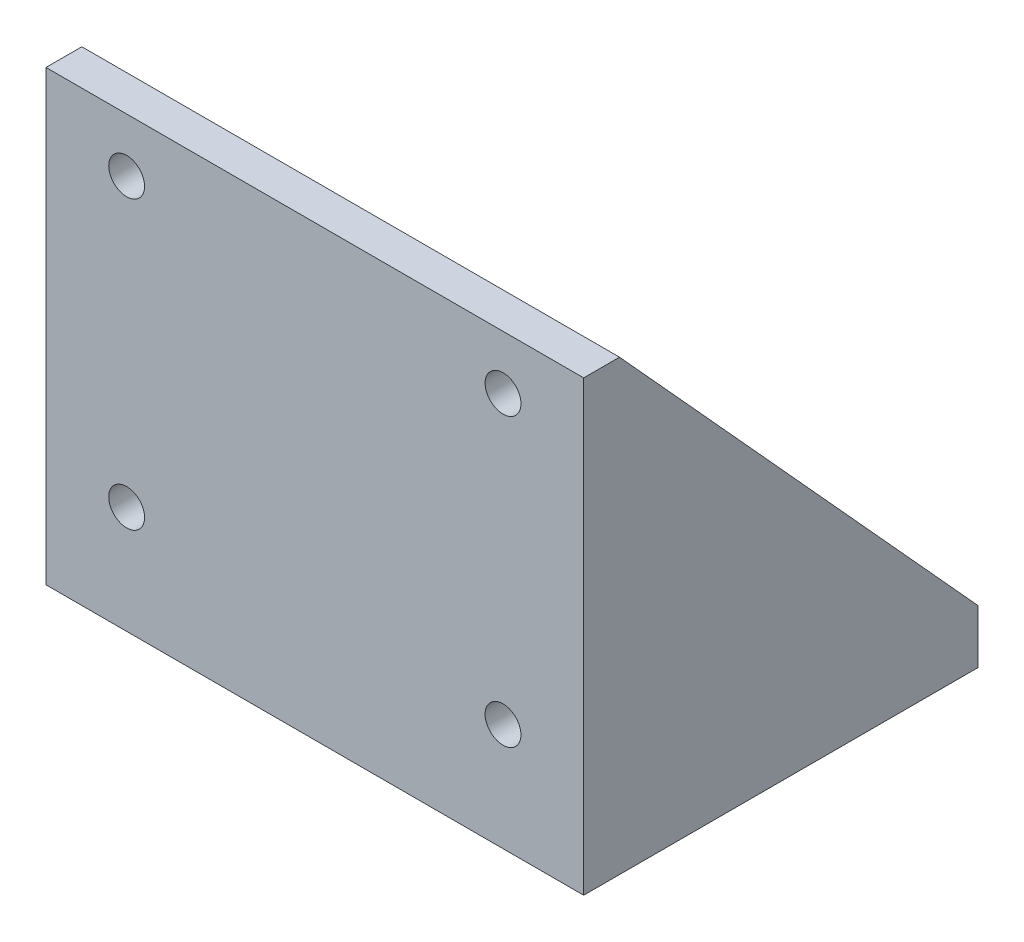
ISO-10303-21;
HEADER;
FILE_DESCRIPTION(('STEP AP214'),'2;1');
FILE_NAME('part.step','',(''),(''),'','','');
FILE_SCHEMA(('AUTOMOTIVE_DESIGN { 1 0 10303 214 1 1 1 1 }'));
ENDSEC;
DATA;
#1=APPLICATION_CONTEXT('core data for automotive mechanical design processes');
#2=APPLICATION_PROTOCOL_DEFINITION('international standard','automotive_design',2000,#1);
#3=PRODUCT_CONTEXT('',#1,'mechanical');
#4=PRODUCT('Part','Part','',(#3));
#5=PRODUCT_RELATED_PRODUCT_CATEGORY('part','',(#4));
#6=PRODUCT_DEFINITION_FORMATION('','',#4);
#7=PRODUCT_DEFINITION_CONTEXT('part definition',#1,'design');
#8=PRODUCT_DEFINITION('design','',#6,#7);
#9=PRODUCT_DEFINITION_SHAPE('','',#8);
#10=(LENGTH_UNIT() NAMED_UNIT(*) SI_UNIT(.MILLI.,.METRE.));
#11=(NAMED_UNIT(*) PLANE_ANGLE_UNIT() SI_UNIT($,.RADIAN.));
#12=(NAMED_UNIT(*) SI_UNIT($,.STERADIAN.) SOLID_ANGLE_UNIT());
#13=UNCERTAINTY_MEASURE_WITH_UNIT(LENGTH_MEASURE(1.E-05),#10,'distance_accuracy_value','');
#14=(GEOMETRIC_REPRESENTATION_CONTEXT(3) GLOBAL_UNCERTAINTY_ASSIGNED_CONTEXT((#13)) GLOBAL_UNIT_ASSIGNED_CONTEXT((#10,
#11,#12)) REPRESENTATION_CONTEXT('',''));
#15=CARTESIAN_POINT('',(0.,0.,0.));
#16=DIRECTION('',(0.,0.,1.));
#17=DIRECTION('',(1.,0.,0.));
#18=AXIS2_PLACEMENT_3D('',#15,#16,#17);
#19=CARTESIAN_POINT('',(0.,6.,40.));
#20=DIRECTION('',(0.,-1.,0.));
#21=DIRECTION('',(0.,0.,-1.));
#22=AXIS2_PLACEMENT_3D('',#19,#20,#21);
#23=PLANE('',#22);
#24=CARTESIAN_POINT('',(30.,6.,20.));
#25=DIRECTION('',(0.,-1.,0.));
#26=DIRECTION('',(0.,0.,-1.));
#27=AXIS2_PLACEMENT_3D('',#24,#25,#26);
#28=CIRCLE('',#27,5.);
#29=CARTESIAN_POINT('',(30.,6.,15.));
#30=VERTEX_POINT('',#29);
#31=EDGE_CURVE('E162',#30,#30,#28,.T.);
#32=ORIENTED_EDGE('',*,*,#31,.T.);
#33=EDGE_LOOP('',(#32));
#34=FACE_BOUND('',#33,.T.);
#35=CARTESIAN_POINT('',(22.5,6.,7.00961894323343));
#36=DIRECTION('',(0.,-1.,0.));
#37=DIRECTION('',(0.,0.,-1.));
#38=AXIS2_PLACEMENT_3D('',#35,#36,#37);
#39=CIRCLE('',#38,1.75);
#40=CARTESIAN_POINT('',(22.5,6.,5.25961894323343));
#41=VERTEX_POINT('',#40);
#42=EDGE_CURVE('E153',#41,#41,#39,.T.);
#43=ORIENTED_EDGE('',*,*,#42,.T.);
#44=EDGE_LOOP('',(#43));
#45=FACE_BOUND('',#44,.T.);
#46=CARTESIAN_POINT('',(22.5,6.,32.9903810567666));
#47=DIRECTION('',(0.,-1.,0.));
#48=DIRECTION('',(0.,0.,-1.));
#49=AXIS2_PLACEMENT_3D('',#46,#47,#48);
#50=CIRCLE('',#49,1.75000000000001);
#51=CARTESIAN_POINT('',(22.5,6.,31.2403810567666));
#52=VERTEX_POINT('',#51);
#53=EDGE_CURVE('E187',#52,#52,#50,.T.);
#54=ORIENTED_EDGE('',*,*,#53,.T.);
#55=EDGE_LOOP('',(#54));
#56=FACE_BOUND('',#55,.T.);
#57=CARTESIAN_POINT('',(45.,6.,20.));
#58=DIRECTION('',(0.,-1.,0.));
#59=DIRECTION('',(0.,0.,-1.));
#60=AXIS2_PLACEMENT_3D('',#57,#58,#59);
#61=CIRCLE('',#60,1.75);
#62=CARTESIAN_POINT('',(45.,6.,18.25));
#63=VERTEX_POINT('',#62);
#64=EDGE_CURVE('E163',#63,#63,#61,.T.);
#65=ORIENTED_EDGE('',*,*,#64,.T.);
#66=EDGE_LOOP('',(#65));
#67=FACE_BOUND('',#66,.T.);
#68=DIRECTION('',(0.,0.,-1.));
#69=VECTOR('',#68,1.);
#70=CARTESIAN_POINT('',(3.,6.,40.));
#71=LINE('',#70,#69);
#72=CARTESIAN_POINT('',(3.,6.,40.));
#73=VERTEX_POINT('',#72);
#74=CARTESIAN_POINT('',(3.,6.,0.));
#75=VERTEX_POINT('',#74);
#76=EDGE_CURVE('E58',#73,#75,#71,.T.);
#77=ORIENTED_EDGE('',*,*,#76,.F.);
#78=DIRECTION('',(-1.,0.,0.));
#79=VECTOR('',#78,1.);
#80=CARTESIAN_POINT('',(0.,6.,40.));
#81=LINE('',#80,#79);
#82=CARTESIAN_POINT('',(57.,6.,40.));
#83=VERTEX_POINT('',#82);
#84=EDGE_CURVE('E119',#83,#73,#81,.T.);
#85=ORIENTED_EDGE('',*,*,#84,.F.);
#86=DIRECTION('',(0.,0.,-1.));
#87=VECTOR('',#86,1.);
#88=CARTESIAN_POINT('',(57.,6.,40.));
#89=LINE('',#88,#87);
#90=CARTESIAN_POINT('',(57.,6.,0.));
#91=VERTEX_POINT('',#90);
#92=EDGE_CURVE('E296',#83,#91,#89,.T.);
#93=ORIENTED_EDGE('',*,*,#92,.T.);
#94=DIRECTION('',(-1.,0.,0.));
#95=VECTOR('',#94,1.);
#96=CARTESIAN_POINT('',(0.,6.,0.));
#97=LINE('',#96,#95);
#98=EDGE_CURVE('E174',#91,#75,#97,.T.);
#99=ORIENTED_EDGE('',*,*,#98,.T.);
#100=EDGE_LOOP('',(#77,#85,#93,#99));
#101=FACE_BOUND('',#100,.T.);
#102=ADVANCED_FACE('F35',(#34,#45,#56,#67,#101),#23,.F.);
#103=CARTESIAN_POINT('',(0.,50.,40.));
#104=DIRECTION('',(0.,0.,-1.));
#105=DIRECTION('',(-1.,0.,0.));
#106=AXIS2_PLACEMENT_3D('',#103,#104,#105);
#107=PLANE('',#106);
#108=CARTESIAN_POINT('',(9.,12.,40.));
#109=DIRECTION('',(0.,0.,-1.));
#110=DIRECTION('',(-1.,0.,0.));
#111=AXIS2_PLACEMENT_3D('',#108,#109,#110);
#112=CIRCLE('',#111,3.00000000000002);
#113=CARTESIAN_POINT('',(5.99999999999998,12.,40.));
#114=VERTEX_POINT('',#113);
#115=EDGE_CURVE('E203',#114,#114,#112,.F.);
#116=ORIENTED_EDGE('',*,*,#115,.T.);
#117=EDGE_LOOP('',(#116));
#118=FACE_BOUND('',#117,.T.);
#119=CARTESIAN_POINT('',(9.,44.,40.));
#120=DIRECTION('',(0.,0.,-1.));
#121=DIRECTION('',(-1.,0.,0.));
#122=AXIS2_PLACEMENT_3D('',#119,#120,#121);
#123=CIRCLE('',#122,3.00000000000002);
#124=CARTESIAN_POINT('',(5.99999999999998,44.,40.));
#125=VERTEX_POINT('',#124);
#126=EDGE_CURVE('E200',#125,#125,#123,.F.);
#127=ORIENTED_EDGE('',*,*,#126,.T.);
#128=EDGE_LOOP('',(#127));
#129=FACE_BOUND('',#128,.T.);
#130=CARTESIAN_POINT('',(51.,44.,40.));
#131=DIRECTION('',(0.,0.,-1.));
#132=DIRECTION('',(-1.,0.,0.));
#133=AXIS2_PLACEMENT_3D('',#130,#131,#132);
#134=CIRCLE('',#133,3.00000000000002);
#135=CARTESIAN_POINT('',(48.,44.,40.));
#136=VERTEX_POINT('',#135);
#137=EDGE_CURVE('E197',#136,#136,#134,.F.);
#138=ORIENTED_EDGE('',*,*,#137,.T.);
#139=EDGE_LOOP('',(#138));
#140=FACE_BOUND('',#139,.T.);
#141=CARTESIAN_POINT('',(51.,12.,40.));
#142=DIRECTION('',(0.,0.,-1.));
#143=DIRECTION('',(-1.,0.,0.));
#144=AXIS2_PLACEMENT_3D('',#141,#142,#143);
#145=CIRCLE('',#144,3.00000000000002);
#146=CARTESIAN_POINT('',(48.,12.,40.));
#147=VERTEX_POINT('',#146);
#148=EDGE_CURVE('E194',#147,#147,#145,.F.);
#149=ORIENTED_EDGE('',*,*,#148,.T.);
#150=EDGE_LOOP('',(#149));
#151=FACE_BOUND('',#150,.T.);
#152=ORIENTED_EDGE('',*,*,#84,.T.);
#153=DIRECTION('',(0.,-1.,0.));
#154=VECTOR('',#153,1.);
#155=CARTESIAN_POINT('',(3.,50.,40.));
#156=LINE('',#155,#154);
#157=CARTESIAN_POINT('',(3.,50.,40.));
#158=VERTEX_POINT('',#157);
#159=EDGE_CURVE('E116',#158,#73,#156,.T.);
#160=ORIENTED_EDGE('',*,*,#159,.F.);
#161=DIRECTION('',(1.,0.,0.));
#162=VECTOR('',#161,1.);
#163=CARTESIAN_POINT('',(0.,50.,40.));
#164=LINE('',#163,#162);
#165=CARTESIAN_POINT('',(57.,50.,40.));
#166=VERTEX_POINT('',#165);
#167=EDGE_CURVE('E102',#158,#166,#164,.T.);
#168=ORIENTED_EDGE('',*,*,#167,.T.);
#169=DIRECTION('',(0.,-1.,0.));
#170=VECTOR('',#169,1.);
#171=CARTESIAN_POINT('',(57.,50.,40.));
#172=LINE('',#171,#170);
#173=EDGE_CURVE('E300',#166,#83,#172,.T.);
#174=ORIENTED_EDGE('',*,*,#173,.T.);
#175=EDGE_LOOP('',(#152,#160,#168,#174));
#176=FACE_BOUND('',#175,.T.);
#177=ADVANCED_FACE('F118',(#118,#129,#140,#151,#176),#107,.T.);
#178=CARTESIAN_POINT('',(0.,0.,40.));
#179=DIRECTION('',(1.,0.,0.));
#180=DIRECTION('',(0.,0.,-1.));
#181=AXIS2_PLACEMENT_3D('',#178,#179,#180);
#182=PLANE('',#181);
#183=DIRECTION('',(0.,0.739940073395944,0.672672793996312));
#184=VECTOR('',#183,1.);
#185=CARTESIAN_POINT('',(0.,6.,0.));
#186=LINE('',#185,#184);
#187=CARTESIAN_POINT('',(0.,6.,0.));
#188=VERTEX_POINT('',#187);
#189=CARTESIAN_POINT('',(0.,50.,40.));
#190=VERTEX_POINT('',#189);
#191=EDGE_CURVE('E130',#188,#190,#186,.T.);
#192=ORIENTED_EDGE('',*,*,#191,.F.);
#193=DIRECTION('',(0.,-1.,0.));
#194=VECTOR('',#193,1.);
#195=CARTESIAN_POINT('',(0.,0.,0.));
#196=LINE('',#195,#194);
#197=CARTESIAN_POINT('',(0.,0.,0.));
#198=VERTEX_POINT('',#197);
#199=EDGE_CURVE('E167',#188,#198,#196,.T.);
#200=ORIENTED_EDGE('',*,*,#199,.T.);
#201=DIRECTION('',(0.,0.,-1.));
#202=VECTOR('',#201,1.);
#203=CARTESIAN_POINT('',(0.,0.,40.));
#204=LINE('',#203,#202);
#205=CARTESIAN_POINT('',(0.,0.,44.));
#206=VERTEX_POINT('',#205);
#207=EDGE_CURVE('E179',#206,#198,#204,.T.);
#208=ORIENTED_EDGE('',*,*,#207,.F.);
#209=DIRECTION('',(0.,-1.,0.));
#210=VECTOR('',#209,1.);
#211=CARTESIAN_POINT('',(0.,50.,44.));
#212=LINE('',#211,#210);
#213=CARTESIAN_POINT('',(0.,50.,44.));
#214=VERTEX_POINT('',#213);
#215=EDGE_CURVE('E144',#214,#206,#212,.T.);
#216=ORIENTED_EDGE('',*,*,#215,.F.);
#217=DIRECTION('',(0.,0.,-1.));
#218=VECTOR('',#217,1.);
#219=CARTESIAN_POINT('',(0.,50.,40.));
#220=LINE('',#219,#218);
#221=EDGE_CURVE('E113',#214,#190,#220,.T.);
#222=ORIENTED_EDGE('',*,*,#221,.T.);
#223=EDGE_LOOP('',(#192,#200,#208,#216,#222));
#224=FACE_BOUND('',#223,.T.);
#225=ADVANCED_FACE('F236',(#224),#182,.F.);
#226=CARTESIAN_POINT('',(0.,0.,40.));
#227=DIRECTION('',(0.,1.,0.));
#228=DIRECTION('',(0.,0.,1.));
#229=AXIS2_PLACEMENT_3D('',#226,#227,#228);
#230=PLANE('',#229);
#231=CARTESIAN_POINT('',(45.,0.,20.));
#232=DIRECTION('',(0.,1.,0.));
#233=DIRECTION('',(0.,0.,1.));
#234=AXIS2_PLACEMENT_3D('',#231,#232,#233);
#235=CIRCLE('',#234,1.75);
#236=CARTESIAN_POINT('',(45.,0.,21.75));
#237=VERTEX_POINT('',#236);
#238=EDGE_CURVE('E150',#237,#237,#235,.T.);
#239=ORIENTED_EDGE('',*,*,#238,.T.);
#240=EDGE_LOOP('',(#239));
#241=FACE_BOUND('',#240,.T.);
#242=CARTESIAN_POINT('',(22.5,0.,32.9903810567666));
#243=DIRECTION('',(0.,1.,0.));
#244=DIRECTION('',(0.,0.,1.));
#245=AXIS2_PLACEMENT_3D('',#242,#243,#244);
#246=CIRCLE('',#245,1.75000000000001);
#247=CARTESIAN_POINT('',(22.5,0.,34.7403810567666));
#248=VERTEX_POINT('',#247);
#249=EDGE_CURVE('E154',#248,#248,#246,.T.);
#250=ORIENTED_EDGE('',*,*,#249,.T.);
#251=EDGE_LOOP('',(#250));
#252=FACE_BOUND('',#251,.T.);
#253=CARTESIAN_POINT('',(22.5,0.,7.00961894323343));
#254=DIRECTION('',(0.,1.,0.));
#255=DIRECTION('',(0.,0.,1.));
#256=AXIS2_PLACEMENT_3D('',#253,#254,#255);
#257=CIRCLE('',#256,1.75);
#258=CARTESIAN_POINT('',(22.5,0.,8.75961894323342));
#259=VERTEX_POINT('',#258);
#260=EDGE_CURVE('E147',#259,#259,#257,.T.);
#261=ORIENTED_EDGE('',*,*,#260,.T.);
#262=EDGE_LOOP('',(#261));
#263=FACE_BOUND('',#262,.T.);
#264=CARTESIAN_POINT('',(30.,0.,20.));
#265=DIRECTION('',(0.,1.,0.));
#266=DIRECTION('',(0.,0.,1.));
#267=AXIS2_PLACEMENT_3D('',#264,#265,#266);
#268=CIRCLE('',#267,5.);
#269=CARTESIAN_POINT('',(30.,0.,25.));
#270=VERTEX_POINT('',#269);
#271=EDGE_CURVE('E159',#270,#270,#268,.T.);
#272=ORIENTED_EDGE('',*,*,#271,.T.);
#273=EDGE_LOOP('',(#272));
#274=FACE_BOUND('',#273,.T.);
#275=DIRECTION('',(1.,0.,0.));
#276=VECTOR('',#275,1.);
#277=CARTESIAN_POINT('',(0.,0.,0.));
#278=LINE('',#277,#276);
#279=CARTESIAN_POINT('',(60.,0.,0.));
#280=VERTEX_POINT('',#279);
#281=EDGE_CURVE('E170',#198,#280,#278,.T.);
#282=ORIENTED_EDGE('',*,*,#281,.T.);
#283=DIRECTION('',(0.,0.,-1.));
#284=VECTOR('',#283,1.);
#285=CARTESIAN_POINT('',(60.,0.,40.));
#286=LINE('',#285,#284);
#287=CARTESIAN_POINT('',(60.,0.,44.));
#288=VERTEX_POINT('',#287);
#289=EDGE_CURVE('E165',#288,#280,#286,.T.);
#290=ORIENTED_EDGE('',*,*,#289,.F.);
#291=DIRECTION('',(-1.,0.,0.));
#292=VECTOR('',#291,1.);
#293=CARTESIAN_POINT('',(0.,0.,44.));
#294=LINE('',#293,#292);
#295=EDGE_CURVE('E141',#288,#206,#294,.T.);
#296=ORIENTED_EDGE('',*,*,#295,.T.);
#297=ORIENTED_EDGE('',*,*,#207,.T.);
#298=EDGE_LOOP('',(#282,#290,#296,#297));
#299=FACE_BOUND('',#298,.T.);
#300=ADVANCED_FACE('F247',(#241,#252,#263,#274,#299),#230,.F.);
#301=CARTESIAN_POINT('',(60.,0.,40.));
#302=DIRECTION('',(-1.,0.,0.));
#303=DIRECTION('',(0.,0.,1.));
#304=AXIS2_PLACEMENT_3D('',#301,#302,#303);
#305=PLANE('',#304);
#306=DIRECTION('',(0.,1.,0.));
#307=VECTOR('',#306,1.);
#308=CARTESIAN_POINT('',(60.,0.,0.));
#309=LINE('',#308,#307);
#310=CARTESIAN_POINT('',(60.,6.,0.));
#311=VERTEX_POINT('',#310);
#312=EDGE_CURVE('E172',#280,#311,#309,.T.);
#313=ORIENTED_EDGE('',*,*,#312,.T.);
#314=DIRECTION('',(0.,0.739940073395944,0.672672793996312));
#315=VECTOR('',#314,1.);
#316=CARTESIAN_POINT('',(60.,6.,0.));
#317=LINE('',#316,#315);
#318=CARTESIAN_POINT('',(60.,50.,40.));
#319=VERTEX_POINT('',#318);
#320=EDGE_CURVE('E295',#311,#319,#317,.T.);
#321=ORIENTED_EDGE('',*,*,#320,.T.);
#322=DIRECTION('',(0.,0.,1.));
#323=VECTOR('',#322,1.);
#324=CARTESIAN_POINT('',(60.,50.,40.));
#325=LINE('',#324,#323);
#326=CARTESIAN_POINT('',(60.,50.,44.));
#327=VERTEX_POINT('',#326);
#328=EDGE_CURVE('E131',#319,#327,#325,.T.);
#329=ORIENTED_EDGE('',*,*,#328,.T.);
#330=DIRECTION('',(0.,-1.,0.));
#331=VECTOR('',#330,1.);
#332=CARTESIAN_POINT('',(60.,50.,44.));
#333=LINE('',#332,#331);
#334=EDGE_CURVE('E140',#327,#288,#333,.T.);
#335=ORIENTED_EDGE('',*,*,#334,.T.);
#336=ORIENTED_EDGE('',*,*,#289,.T.);
#337=EDGE_LOOP('',(#313,#321,#329,#335,#336));
#338=FACE_BOUND('',#337,.T.);
#339=ADVANCED_FACE('F244',(#338),#305,.F.);
#340=CARTESIAN_POINT('',(0.,0.,0.));
#341=DIRECTION('',(0.,0.,-1.));
#342=DIRECTION('',(-1.,0.,0.));
#343=AXIS2_PLACEMENT_3D('',#340,#341,#342);
#344=PLANE('',#343);
#345=ORIENTED_EDGE('',*,*,#199,.F.);
#346=DIRECTION('',(-1.,0.,0.));
#347=VECTOR('',#346,1.);
#348=CARTESIAN_POINT('',(3.,6.,0.));
#349=LINE('',#348,#347);
#350=EDGE_CURVE('E51',#75,#188,#349,.T.);
#351=ORIENTED_EDGE('',*,*,#350,.F.);
#352=ORIENTED_EDGE('',*,*,#98,.F.);
#353=EDGE_CURVE('E166',#311,#91,#97,.T.);
#354=ORIENTED_EDGE('',*,*,#353,.F.);
#355=ORIENTED_EDGE('',*,*,#312,.F.);
#356=ORIENTED_EDGE('',*,*,#281,.F.);
#357=EDGE_LOOP('',(#345,#351,#352,#354,#355,#356));
#358=FACE_BOUND('',#357,.T.);
#359=ADVANCED_FACE('F242',(#358),#344,.T.);
#360=CARTESIAN_POINT('',(30.,0.,20.));
#361=DIRECTION('',(0.,1.,0.));
#362=DIRECTION('',(0.,0.,1.));
#363=AXIS2_PLACEMENT_3D('',#360,#361,#362);
#364=CYLINDRICAL_SURFACE('',#363,5.);
#365=ORIENTED_EDGE('',*,*,#271,.F.);
#366=EDGE_LOOP('',(#365));
#367=FACE_BOUND('',#366,.T.);
#368=ORIENTED_EDGE('',*,*,#31,.F.);
#369=EDGE_LOOP('',(#368));
#370=FACE_BOUND('',#369,.T.);
#371=ADVANCED_FACE('F339',(#367,#370),#364,.F.);
#372=CARTESIAN_POINT('',(22.5,0.,7.00961894323343));
#373=DIRECTION('',(0.,1.,0.));
#374=DIRECTION('',(0.,0.,1.));
#375=AXIS2_PLACEMENT_3D('',#372,#373,#374);
#376=CYLINDRICAL_SURFACE('',#375,1.75);
#377=ORIENTED_EDGE('',*,*,#260,.F.);
#378=EDGE_LOOP('',(#377));
#379=FACE_BOUND('',#378,.T.);
#380=ORIENTED_EDGE('',*,*,#42,.F.);
#381=EDGE_LOOP('',(#380));
#382=FACE_BOUND('',#381,.T.);
#383=ADVANCED_FACE('F336',(#379,#382),#376,.F.);
#384=CARTESIAN_POINT('',(22.5,0.,32.9903810567666));
#385=DIRECTION('',(0.,1.,0.));
#386=DIRECTION('',(0.,0.,1.));
#387=AXIS2_PLACEMENT_3D('',#384,#385,#386);
#388=CYLINDRICAL_SURFACE('',#387,1.75000000000001);
#389=ORIENTED_EDGE('',*,*,#249,.F.);
#390=EDGE_LOOP('',(#389));
#391=FACE_BOUND('',#390,.T.);
#392=ORIENTED_EDGE('',*,*,#53,.F.);
#393=EDGE_LOOP('',(#392));
#394=FACE_BOUND('',#393,.T.);
#395=ADVANCED_FACE('F332',(#391,#394),#388,.F.);
#396=CARTESIAN_POINT('',(45.,0.,20.));
#397=DIRECTION('',(0.,1.,0.));
#398=DIRECTION('',(0.,0.,1.));
#399=AXIS2_PLACEMENT_3D('',#396,#397,#398);
#400=CYLINDRICAL_SURFACE('',#399,1.75);
#401=ORIENTED_EDGE('',*,*,#238,.F.);
#402=EDGE_LOOP('',(#401));
#403=FACE_BOUND('',#402,.T.);
#404=ORIENTED_EDGE('',*,*,#64,.F.);
#405=EDGE_LOOP('',(#404));
#406=FACE_BOUND('',#405,.T.);
#407=ADVANCED_FACE('F328',(#403,#406),#400,.F.);
#408=CARTESIAN_POINT('',(0.,50.,44.));
#409=DIRECTION('',(0.,0.,1.));
#410=DIRECTION('',(1.,0.,0.));
#411=AXIS2_PLACEMENT_3D('',#408,#409,#410);
#412=PLANE('',#411);
#413=CARTESIAN_POINT('',(9.,12.,44.));
#414=DIRECTION('',(0.,0.,-1.));
#415=DIRECTION('',(1.,0.,0.));
#416=AXIS2_PLACEMENT_3D('',#413,#414,#415);
#417=CIRCLE('',#416,2.);
#418=CARTESIAN_POINT('',(11.,12.,44.));
#419=VERTEX_POINT('',#418);
#420=EDGE_CURVE('E280',#419,#419,#417,.T.);
#421=ORIENTED_EDGE('',*,*,#420,.T.);
#422=EDGE_LOOP('',(#421));
#423=FACE_BOUND('',#422,.T.);
#424=CARTESIAN_POINT('',(9.,44.,44.));
#425=DIRECTION('',(0.,0.,-1.));
#426=DIRECTION('',(-1.,0.,0.));
#427=AXIS2_PLACEMENT_3D('',#424,#425,#426);
#428=CIRCLE('',#427,2.);
#429=CARTESIAN_POINT('',(7.,44.,44.));
#430=VERTEX_POINT('',#429);
#431=EDGE_CURVE('E282',#430,#430,#428,.T.);
#432=ORIENTED_EDGE('',*,*,#431,.T.);
#433=EDGE_LOOP('',(#432));
#434=FACE_BOUND('',#433,.T.);
#435=CARTESIAN_POINT('',(51.,44.,44.));
#436=DIRECTION('',(0.,0.,-1.));
#437=DIRECTION('',(1.,0.,0.));
#438=AXIS2_PLACEMENT_3D('',#435,#436,#437);
#439=CIRCLE('',#438,2.);
#440=CARTESIAN_POINT('',(53.,44.,44.));
#441=VERTEX_POINT('',#440);
#442=EDGE_CURVE('E285',#441,#441,#439,.T.);
#443=ORIENTED_EDGE('',*,*,#442,.T.);
#444=EDGE_LOOP('',(#443));
#445=FACE_BOUND('',#444,.T.);
#446=CARTESIAN_POINT('',(51.,12.,44.));
#447=DIRECTION('',(0.,0.,-1.));
#448=DIRECTION('',(-1.,0.,0.));
#449=AXIS2_PLACEMENT_3D('',#446,#447,#448);
#450=CIRCLE('',#449,2.);
#451=CARTESIAN_POINT('',(49.,12.,44.));
#452=VERTEX_POINT('',#451);
#453=EDGE_CURVE('E289',#452,#452,#450,.T.);
#454=ORIENTED_EDGE('',*,*,#453,.T.);
#455=EDGE_LOOP('',(#454));
#456=FACE_BOUND('',#455,.T.);
#457=ORIENTED_EDGE('',*,*,#295,.F.);
#458=ORIENTED_EDGE('',*,*,#334,.F.);
#459=DIRECTION('',(-1.,0.,0.));
#460=VECTOR('',#459,1.);
#461=CARTESIAN_POINT('',(0.,50.,44.));
#462=LINE('',#461,#460);
#463=EDGE_CURVE('E133',#327,#214,#462,.T.);
#464=ORIENTED_EDGE('',*,*,#463,.T.);
#465=ORIENTED_EDGE('',*,*,#215,.T.);
#466=EDGE_LOOP('',(#457,#458,#464,#465));
#467=FACE_BOUND('',#466,.T.);
#468=ADVANCED_FACE('F326',(#423,#434,#445,#456,#467),#412,.T.);
#469=CARTESIAN_POINT('',(0.,50.,0.));
#470=DIRECTION('',(0.,1.,0.));
#471=DIRECTION('',(0.,0.,1.));
#472=AXIS2_PLACEMENT_3D('',#469,#470,#471);
#473=PLANE('',#472);
#474=ORIENTED_EDGE('',*,*,#221,.F.);
#475=ORIENTED_EDGE('',*,*,#463,.F.);
#476=ORIENTED_EDGE('',*,*,#328,.F.);
#477=DIRECTION('',(1.,0.,0.));
#478=VECTOR('',#477,1.);
#479=CARTESIAN_POINT('',(57.,50.,40.));
#480=LINE('',#479,#478);
#481=EDGE_CURVE('E110',#166,#319,#480,.T.);
#482=ORIENTED_EDGE('',*,*,#481,.F.);
#483=ORIENTED_EDGE('',*,*,#167,.F.);
#484=EDGE_CURVE('E107',#190,#158,#164,.T.);
#485=ORIENTED_EDGE('',*,*,#484,.F.);
#486=EDGE_LOOP('',(#474,#475,#476,#482,#483,#485));
#487=FACE_BOUND('',#486,.T.);
#488=ADVANCED_FACE('F105',(#487),#473,.T.);
#489=CARTESIAN_POINT('',(57.,6.,0.));
#490=DIRECTION('',(0.,0.672672793996313,-0.739940073395944));
#491=DIRECTION('',(0.,0.739940073395944,0.672672793996313));
#492=AXIS2_PLACEMENT_3D('',#489,#490,#491);
#493=PLANE('',#492);
#494=ORIENTED_EDGE('',*,*,#320,.F.);
#495=ORIENTED_EDGE('',*,*,#353,.T.);
#496=DIRECTION('',(0.,0.739940073395944,0.672672793996312));
#497=VECTOR('',#496,1.);
#498=CARTESIAN_POINT('',(57.,6.,0.));
#499=LINE('',#498,#497);
#500=EDGE_CURVE('E298',#91,#166,#499,.T.);
#501=ORIENTED_EDGE('',*,*,#500,.T.);
#502=ORIENTED_EDGE('',*,*,#481,.T.);
#503=EDGE_LOOP('',(#494,#495,#501,#502));
#504=FACE_BOUND('',#503,.T.);
#505=ADVANCED_FACE('F305',(#504),#493,.T.);
#506=CARTESIAN_POINT('',(57.,0.,0.));
#507=DIRECTION('',(-1.,0.,0.));
#508=DIRECTION('',(0.,0.,1.));
#509=AXIS2_PLACEMENT_3D('',#506,#507,#508);
#510=PLANE('',#509);
#511=ORIENTED_EDGE('',*,*,#92,.F.);
#512=ORIENTED_EDGE('',*,*,#173,.F.);
#513=ORIENTED_EDGE('',*,*,#500,.F.);
#514=EDGE_LOOP('',(#511,#512,#513));
#515=FACE_BOUND('',#514,.T.);
#516=ADVANCED_FACE('F313',(#515),#510,.T.);
#517=CARTESIAN_POINT('',(3.,6.,0.));
#518=DIRECTION('',(0.,-0.672672793996313,0.739940073395944));
#519=DIRECTION('',(0.,-0.739940073395944,-0.672672793996313));
#520=AXIS2_PLACEMENT_3D('',#517,#518,#519);
#521=PLANE('',#520);
#522=ORIENTED_EDGE('',*,*,#191,.T.);
#523=ORIENTED_EDGE('',*,*,#484,.T.);
#524=DIRECTION('',(0.,0.739940073395944,0.672672793996312));
#525=VECTOR('',#524,1.);
#526=CARTESIAN_POINT('',(3.,6.,0.));
#527=LINE('',#526,#525);
#528=EDGE_CURVE('E121',#75,#158,#527,.T.);
#529=ORIENTED_EDGE('',*,*,#528,.F.);
#530=ORIENTED_EDGE('',*,*,#350,.T.);
#531=EDGE_LOOP('',(#522,#523,#529,#530));
#532=FACE_BOUND('',#531,.T.);
#533=ADVANCED_FACE('F128',(#532),#521,.F.);
#534=CARTESIAN_POINT('',(3.,0.,0.));
#535=DIRECTION('',(-1.,0.,0.));
#536=DIRECTION('',(0.,0.,1.));
#537=AXIS2_PLACEMENT_3D('',#534,#535,#536);
#538=PLANE('',#537);
#539=ORIENTED_EDGE('',*,*,#76,.T.);
#540=ORIENTED_EDGE('',*,*,#528,.T.);
#541=ORIENTED_EDGE('',*,*,#159,.T.);
#542=EDGE_LOOP('',(#539,#540,#541));
#543=FACE_BOUND('',#542,.T.);
#544=ADVANCED_FACE('F124',(#543),#538,.F.);
#545=CARTESIAN_POINT('',(51.,12.,44.));
#546=DIRECTION('',(0.,0.,-1.));
#547=DIRECTION('',(-1.,0.,0.));
#548=AXIS2_PLACEMENT_3D('',#545,#546,#547);
#549=CYLINDRICAL_SURFACE('',#548,2.);
#550=CARTESIAN_POINT('',(51.,12.,41.));
#551=DIRECTION('',(0.,0.,-1.));
#552=DIRECTION('',(-1.,0.,0.));
#553=AXIS2_PLACEMENT_3D('',#550,#551,#552);
#554=CIRCLE('',#553,2.);
#555=CARTESIAN_POINT('',(49.,12.,41.));
#556=VERTEX_POINT('',#555);
#557=EDGE_CURVE('E11',#556,#556,#554,.T.);
#558=ORIENTED_EDGE('',*,*,#557,.T.);
#559=EDGE_LOOP('',(#558));
#560=FACE_BOUND('',#559,.T.);
#561=ORIENTED_EDGE('',*,*,#453,.F.);
#562=EDGE_LOOP('',(#561));
#563=FACE_BOUND('',#562,.T.);
#564=ADVANCED_FACE('F374',(#560,#563),#549,.F.);
#565=CARTESIAN_POINT('',(51.,44.,44.));
#566=DIRECTION('',(0.,0.,-1.));
#567=DIRECTION('',(-1.,0.,0.));
#568=AXIS2_PLACEMENT_3D('',#565,#566,#567);
#569=CYLINDRICAL_SURFACE('',#568,2.);
#570=CARTESIAN_POINT('',(51.,44.,41.));
#571=DIRECTION('',(0.,0.,-1.));
#572=DIRECTION('',(-1.,0.,0.));
#573=AXIS2_PLACEMENT_3D('',#570,#571,#572);
#574=CIRCLE('',#573,2.);
#575=CARTESIAN_POINT('',(49.,44.,41.));
#576=VERTEX_POINT('',#575);
#577=EDGE_CURVE('E44',#576,#576,#574,.T.);
#578=ORIENTED_EDGE('',*,*,#577,.T.);
#579=EDGE_LOOP('',(#578));
#580=FACE_BOUND('',#579,.T.);
#581=ORIENTED_EDGE('',*,*,#442,.F.);
#582=EDGE_LOOP('',(#581));
#583=FACE_BOUND('',#582,.T.);
#584=ADVANCED_FACE('F211',(#580,#583),#569,.F.);
#585=CARTESIAN_POINT('',(9.,44.,44.));
#586=DIRECTION('',(0.,0.,-1.));
#587=DIRECTION('',(-1.,0.,0.));
#588=AXIS2_PLACEMENT_3D('',#585,#586,#587);
#589=CYLINDRICAL_SURFACE('',#588,2.);
#590=CARTESIAN_POINT('',(9.,44.,41.));
#591=DIRECTION('',(0.,0.,-1.));
#592=DIRECTION('',(-1.,0.,0.));
#593=AXIS2_PLACEMENT_3D('',#590,#591,#592);
#594=CIRCLE('',#593,2.);
#595=CARTESIAN_POINT('',(7.,44.,41.));
#596=VERTEX_POINT('',#595);
#597=EDGE_CURVE('E206',#596,#596,#594,.T.);
#598=ORIENTED_EDGE('',*,*,#597,.T.);
#599=EDGE_LOOP('',(#598));
#600=FACE_BOUND('',#599,.T.);
#601=ORIENTED_EDGE('',*,*,#431,.F.);
#602=EDGE_LOOP('',(#601));
#603=FACE_BOUND('',#602,.T.);
#604=ADVANCED_FACE('F271',(#600,#603),#589,.F.);
#605=CARTESIAN_POINT('',(9.,12.,44.));
#606=DIRECTION('',(0.,0.,-1.));
#607=DIRECTION('',(-1.,0.,0.));
#608=AXIS2_PLACEMENT_3D('',#605,#606,#607);
#609=CYLINDRICAL_SURFACE('',#608,2.);
#610=CARTESIAN_POINT('',(9.,12.,41.));
#611=DIRECTION('',(0.,0.,-1.));
#612=DIRECTION('',(-1.,0.,0.));
#613=AXIS2_PLACEMENT_3D('',#610,#611,#612);
#614=CIRCLE('',#613,2.);
#615=CARTESIAN_POINT('',(7.,12.,41.));
#616=VERTEX_POINT('',#615);
#617=EDGE_CURVE('E182',#616,#616,#614,.T.);
#618=ORIENTED_EDGE('',*,*,#617,.T.);
#619=EDGE_LOOP('',(#618));
#620=FACE_BOUND('',#619,.T.);
#621=ORIENTED_EDGE('',*,*,#420,.F.);
#622=EDGE_LOOP('',(#621));
#623=FACE_BOUND('',#622,.T.);
#624=ADVANCED_FACE('F260',(#620,#623),#609,.F.);
#625=CARTESIAN_POINT('',(9.,12.,41.));
#626=DIRECTION('',(0.,0.,-1.));
#627=DIRECTION('',(-1.,0.,0.));
#628=AXIS2_PLACEMENT_3D('',#625,#626,#627);
#629=CONICAL_SURFACE('',#628,2.,0.785398163397452);
#630=ORIENTED_EDGE('',*,*,#115,.F.);
#631=EDGE_LOOP('',(#630));
#632=FACE_BOUND('',#631,.T.);
#633=ORIENTED_EDGE('',*,*,#617,.F.);
#634=EDGE_LOOP('',(#633));
#635=FACE_BOUND('',#634,.T.);
#636=ADVANCED_FACE('F223',(#632,#635),#629,.F.);
#637=CARTESIAN_POINT('',(9.,44.,41.));
#638=DIRECTION('',(0.,0.,-1.));
#639=DIRECTION('',(-1.,0.,0.));
#640=AXIS2_PLACEMENT_3D('',#637,#638,#639);
#641=CONICAL_SURFACE('',#640,2.,0.785398163397452);
#642=ORIENTED_EDGE('',*,*,#126,.F.);
#643=EDGE_LOOP('',(#642));
#644=FACE_BOUND('',#643,.T.);
#645=ORIENTED_EDGE('',*,*,#597,.F.);
#646=EDGE_LOOP('',(#645));
#647=FACE_BOUND('',#646,.T.);
#648=ADVANCED_FACE('F216',(#644,#647),#641,.F.);
#649=CARTESIAN_POINT('',(51.,44.,41.));
#650=DIRECTION('',(0.,0.,-1.));
#651=DIRECTION('',(-1.,0.,0.));
#652=AXIS2_PLACEMENT_3D('',#649,#650,#651);
#653=CONICAL_SURFACE('',#652,2.,0.785398163397451);
#654=ORIENTED_EDGE('',*,*,#137,.F.);
#655=EDGE_LOOP('',(#654));
#656=FACE_BOUND('',#655,.T.);
#657=ORIENTED_EDGE('',*,*,#577,.F.);
#658=EDGE_LOOP('',(#657));
#659=FACE_BOUND('',#658,.T.);
#660=ADVANCED_FACE('F214',(#656,#659),#653,.F.);
#661=CARTESIAN_POINT('',(51.,12.,41.));
#662=DIRECTION('',(0.,0.,-1.));
#663=DIRECTION('',(-1.,0.,0.));
#664=AXIS2_PLACEMENT_3D('',#661,#662,#663);
#665=CONICAL_SURFACE('',#664,2.,0.785398163397451);
#666=ORIENTED_EDGE('',*,*,#148,.F.);
#667=EDGE_LOOP('',(#666));
#668=FACE_BOUND('',#667,.T.);
#669=ORIENTED_EDGE('',*,*,#557,.F.);
#670=EDGE_LOOP('',(#669));
#671=FACE_BOUND('',#670,.T.);
#672=ADVANCED_FACE('F38',(#668,#671),#665,.F.);
#673=CLOSED_SHELL('',(#102,#177,#225,#300,#339,#359,#371,#383,#395,#407,#468,#488,#505,#516,
#533,#544,#564,#584,#604,#624,#636,#648,#660,#672));
#674=MANIFOLD_SOLID_BREP('B2',#673);
#675=ADVANCED_BREP_SHAPE_REPRESENTATION('',(#18,#674),#14);
#676=SHAPE_DEFINITION_REPRESENTATION(#9,#675);
ENDSEC;
END-ISO-10303-21;
